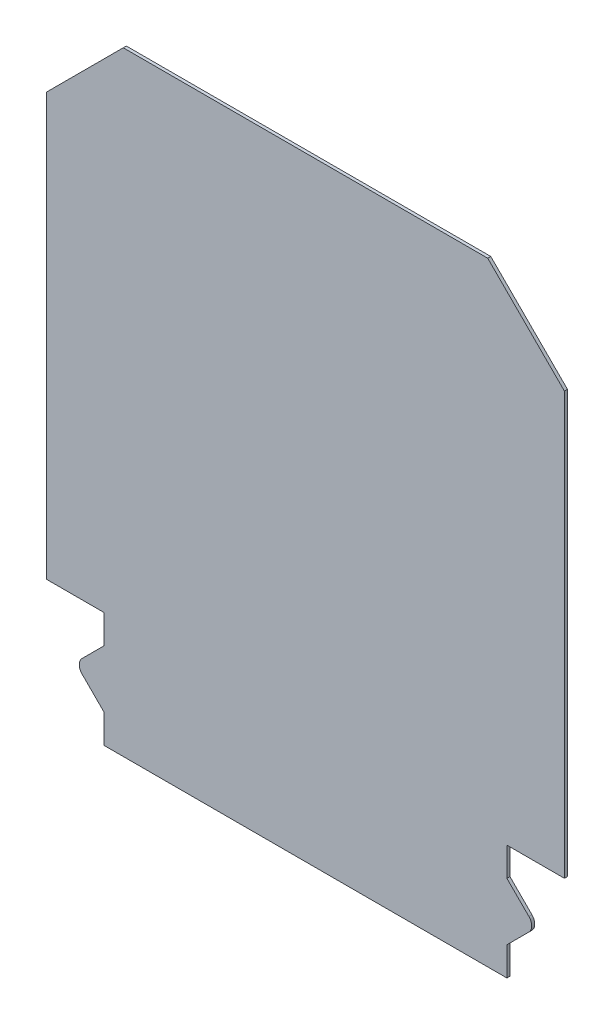
ISO-10303-21;
HEADER;
FILE_DESCRIPTION(('STEP AP214'),'2;1');
FILE_NAME('part.step','',(''),(''),'','','');
FILE_SCHEMA(('AUTOMOTIVE_DESIGN { 1 0 10303 214 1 1 1 1 }'));
ENDSEC;
DATA;
#1=APPLICATION_CONTEXT('core data for automotive mechanical design processes');
#2=APPLICATION_PROTOCOL_DEFINITION('international standard','automotive_design',2000,#1);
#3=PRODUCT_CONTEXT('',#1,'mechanical');
#4=PRODUCT('Part','Part','',(#3));
#5=PRODUCT_RELATED_PRODUCT_CATEGORY('part','',(#4));
#6=PRODUCT_DEFINITION_FORMATION('','',#4);
#7=PRODUCT_DEFINITION_CONTEXT('part definition',#1,'design');
#8=PRODUCT_DEFINITION('design','',#6,#7);
#9=PRODUCT_DEFINITION_SHAPE('','',#8);
#10=(LENGTH_UNIT() NAMED_UNIT(*) SI_UNIT(.MILLI.,.METRE.));
#11=(NAMED_UNIT(*) PLANE_ANGLE_UNIT() SI_UNIT($,.RADIAN.));
#12=(NAMED_UNIT(*) SI_UNIT($,.STERADIAN.) SOLID_ANGLE_UNIT());
#13=UNCERTAINTY_MEASURE_WITH_UNIT(LENGTH_MEASURE(1.E-05),#10,'distance_accuracy_value','');
#14=(GEOMETRIC_REPRESENTATION_CONTEXT(3) GLOBAL_UNCERTAINTY_ASSIGNED_CONTEXT((#13)) GLOBAL_UNIT_ASSIGNED_CONTEXT((#10,
#11,#12)) REPRESENTATION_CONTEXT('',''));
#15=CARTESIAN_POINT('',(0.,0.,0.));
#16=DIRECTION('',(0.,0.,1.));
#17=DIRECTION('',(1.,0.,0.));
#18=AXIS2_PLACEMENT_3D('',#15,#16,#17);
#19=CARTESIAN_POINT('',(0.,0.,3.175));
#20=DIRECTION('',(1.,0.,0.));
#21=DIRECTION('',(0.,0.,-1.));
#22=AXIS2_PLACEMENT_3D('',#19,#20,#21);
#23=PLANE('',#22);
#24=DIRECTION('',(0.,-1.,0.));
#25=VECTOR('',#24,1.);
#26=CARTESIAN_POINT('',(0.,0.,0.));
#27=LINE('',#26,#25);
#28=CARTESIAN_POINT('',(0.,560.,0.));
#29=VERTEX_POINT('',#28);
#30=CARTESIAN_POINT('',(0.,120.,0.));
#31=VERTEX_POINT('',#30);
#32=EDGE_CURVE('E249',#29,#31,#27,.T.);
#33=ORIENTED_EDGE('',*,*,#32,.T.);
#34=DIRECTION('',(0.,0.,1.));
#35=VECTOR('',#34,1.);
#36=CARTESIAN_POINT('',(0.,120.,0.));
#37=LINE('',#36,#35);
#38=CARTESIAN_POINT('',(0.,120.,3.175));
#39=VERTEX_POINT('',#38);
#40=EDGE_CURVE('E230',#31,#39,#37,.T.);
#41=ORIENTED_EDGE('',*,*,#40,.T.);
#42=DIRECTION('',(0.,-1.,0.));
#43=VECTOR('',#42,1.);
#44=CARTESIAN_POINT('',(0.,0.,3.175));
#45=LINE('',#44,#43);
#46=CARTESIAN_POINT('',(0.,560.,3.175));
#47=VERTEX_POINT('',#46);
#48=EDGE_CURVE('E181',#47,#39,#45,.T.);
#49=ORIENTED_EDGE('',*,*,#48,.F.);
#50=DIRECTION('',(0.,0.,1.));
#51=VECTOR('',#50,1.);
#52=CARTESIAN_POINT('',(0.,560.,0.));
#53=LINE('',#52,#51);
#54=EDGE_CURVE('E244',#29,#47,#53,.T.);
#55=ORIENTED_EDGE('',*,*,#54,.F.);
#56=EDGE_LOOP('',(#33,#41,#49,#55));
#57=FACE_BOUND('',#56,.T.);
#58=ADVANCED_FACE('F33',(#57),#23,.F.);
#59=CARTESIAN_POINT('',(0.,0.,3.175));
#60=DIRECTION('',(0.,1.,0.));
#61=DIRECTION('',(0.,0.,1.));
#62=AXIS2_PLACEMENT_3D('',#59,#60,#61);
#63=PLANE('',#62);
#64=DIRECTION('',(1.,0.,0.));
#65=VECTOR('',#64,1.);
#66=CARTESIAN_POINT('',(0.,0.,0.));
#67=LINE('',#66,#65);
#68=CARTESIAN_POINT('',(60.,0.,0.));
#69=VERTEX_POINT('',#68);
#70=CARTESIAN_POINT('',(480.,0.,0.));
#71=VERTEX_POINT('',#70);
#72=EDGE_CURVE('E187',#69,#71,#67,.T.);
#73=ORIENTED_EDGE('',*,*,#72,.T.);
#74=DIRECTION('',(0.,0.,1.));
#75=VECTOR('',#74,1.);
#76=CARTESIAN_POINT('',(480.,0.,0.));
#77=LINE('',#76,#75);
#78=CARTESIAN_POINT('',(480.,0.,3.175));
#79=VERTEX_POINT('',#78);
#80=EDGE_CURVE('E265',#71,#79,#77,.T.);
#81=ORIENTED_EDGE('',*,*,#80,.T.);
#82=DIRECTION('',(1.,0.,0.));
#83=VECTOR('',#82,1.);
#84=CARTESIAN_POINT('',(0.,0.,3.175));
#85=LINE('',#84,#83);
#86=CARTESIAN_POINT('',(60.,0.,3.175));
#87=VERTEX_POINT('',#86);
#88=EDGE_CURVE('E185',#87,#79,#85,.T.);
#89=ORIENTED_EDGE('',*,*,#88,.F.);
#90=DIRECTION('',(0.,0.,1.));
#91=VECTOR('',#90,1.);
#92=CARTESIAN_POINT('',(60.,0.,0.));
#93=LINE('',#92,#91);
#94=EDGE_CURVE('E240',#69,#87,#93,.T.);
#95=ORIENTED_EDGE('',*,*,#94,.F.);
#96=EDGE_LOOP('',(#73,#81,#89,#95));
#97=FACE_BOUND('',#96,.T.);
#98=ADVANCED_FACE('F263',(#97),#63,.F.);
#99=CARTESIAN_POINT('',(540.,0.,3.175));
#100=DIRECTION('',(-1.,0.,0.));
#101=DIRECTION('',(0.,0.,1.));
#102=AXIS2_PLACEMENT_3D('',#99,#100,#101);
#103=PLANE('',#102);
#104=DIRECTION('',(0.,1.,0.));
#105=VECTOR('',#104,1.);
#106=CARTESIAN_POINT('',(540.,0.,0.));
#107=LINE('',#106,#105);
#108=CARTESIAN_POINT('',(540.,120.,0.));
#109=VERTEX_POINT('',#108);
#110=CARTESIAN_POINT('',(540.,560.,0.));
#111=VERTEX_POINT('',#110);
#112=EDGE_CURVE('E182',#109,#111,#107,.T.);
#113=ORIENTED_EDGE('',*,*,#112,.T.);
#114=DIRECTION('',(0.,0.,1.));
#115=VECTOR('',#114,1.);
#116=CARTESIAN_POINT('',(540.,560.,0.));
#117=LINE('',#116,#115);
#118=CARTESIAN_POINT('',(540.,560.,3.175));
#119=VERTEX_POINT('',#118);
#120=EDGE_CURVE('E162',#111,#119,#117,.T.);
#121=ORIENTED_EDGE('',*,*,#120,.T.);
#122=DIRECTION('',(0.,1.,0.));
#123=VECTOR('',#122,1.);
#124=CARTESIAN_POINT('',(540.,0.,3.175));
#125=LINE('',#124,#123);
#126=CARTESIAN_POINT('',(540.,120.,3.175));
#127=VERTEX_POINT('',#126);
#128=EDGE_CURVE('E253',#127,#119,#125,.T.);
#129=ORIENTED_EDGE('',*,*,#128,.F.);
#130=DIRECTION('',(0.,0.,1.));
#131=VECTOR('',#130,1.);
#132=CARTESIAN_POINT('',(540.,120.,0.));
#133=LINE('',#132,#131);
#134=EDGE_CURVE('E275',#109,#127,#133,.T.);
#135=ORIENTED_EDGE('',*,*,#134,.F.);
#136=EDGE_LOOP('',(#113,#121,#129,#135));
#137=FACE_BOUND('',#136,.T.);
#138=ADVANCED_FACE('F329',(#137),#103,.F.);
#139=CARTESIAN_POINT('',(0.,640.,3.175));
#140=DIRECTION('',(0.,-1.,0.));
#141=DIRECTION('',(0.,0.,-1.));
#142=AXIS2_PLACEMENT_3D('',#139,#140,#141);
#143=PLANE('',#142);
#144=DIRECTION('',(-1.,0.,0.));
#145=VECTOR('',#144,1.);
#146=CARTESIAN_POINT('',(0.,640.,3.175));
#147=LINE('',#146,#145);
#148=CARTESIAN_POINT('',(460.,640.,3.175));
#149=VERTEX_POINT('',#148);
#150=CARTESIAN_POINT('',(80.,640.,3.175));
#151=VERTEX_POINT('',#150);
#152=EDGE_CURVE('E174',#149,#151,#147,.T.);
#153=ORIENTED_EDGE('',*,*,#152,.F.);
#154=DIRECTION('',(0.,0.,1.));
#155=VECTOR('',#154,1.);
#156=CARTESIAN_POINT('',(460.,640.,0.));
#157=LINE('',#156,#155);
#158=CARTESIAN_POINT('',(460.,640.,0.));
#159=VERTEX_POINT('',#158);
#160=EDGE_CURVE('E159',#159,#149,#157,.T.);
#161=ORIENTED_EDGE('',*,*,#160,.F.);
#162=DIRECTION('',(-1.,0.,0.));
#163=VECTOR('',#162,1.);
#164=CARTESIAN_POINT('',(0.,640.,0.));
#165=LINE('',#164,#163);
#166=CARTESIAN_POINT('',(80.0000000000001,640.,0.));
#167=VERTEX_POINT('',#166);
#168=EDGE_CURVE('E172',#159,#167,#165,.T.);
#169=ORIENTED_EDGE('',*,*,#168,.T.);
#170=DIRECTION('',(0.,0.,1.));
#171=VECTOR('',#170,1.);
#172=CARTESIAN_POINT('',(80.,640.,0.));
#173=LINE('',#172,#171);
#174=EDGE_CURVE('E247',#167,#151,#173,.T.);
#175=ORIENTED_EDGE('',*,*,#174,.T.);
#176=EDGE_LOOP('',(#153,#161,#169,#175));
#177=FACE_BOUND('',#176,.T.);
#178=ADVANCED_FACE('F170',(#177),#143,.F.);
#179=CARTESIAN_POINT('',(0.,0.,3.175));
#180=DIRECTION('',(0.,0.,-1.));
#181=DIRECTION('',(-1.,0.,0.));
#182=AXIS2_PLACEMENT_3D('',#179,#180,#181);
#183=PLANE('',#182);
#184=DIRECTION('',(-0.707106781186547,-0.707106781186547,0.));
#185=VECTOR('',#184,1.);
#186=CARTESIAN_POINT('',(510.,60.,3.175));
#187=LINE('',#186,#185);
#188=CARTESIAN_POINT('',(502.928932188135,52.9289321881345,3.175));
#189=VERTEX_POINT('',#188);
#190=CARTESIAN_POINT('',(480.,30.,3.175));
#191=VERTEX_POINT('',#190);
#192=EDGE_CURVE('E292',#189,#191,#187,.T.);
#193=ORIENTED_EDGE('',*,*,#192,.F.);
#194=CARTESIAN_POINT('',(495.857864376269,60.,3.175));
#195=DIRECTION('',(0.,0.,-1.));
#196=DIRECTION('',(-1.,0.,0.));
#197=AXIS2_PLACEMENT_3D('',#194,#195,#196);
#198=CIRCLE('',#197,10.);
#199=CARTESIAN_POINT('',(502.928932188135,67.0710678118655,3.175));
#200=VERTEX_POINT('',#199);
#201=EDGE_CURVE('E196',#189,#200,#198,.F.);
#202=ORIENTED_EDGE('',*,*,#201,.T.);
#203=DIRECTION('',(0.707106781186547,-0.707106781186548,0.));
#204=VECTOR('',#203,1.);
#205=CARTESIAN_POINT('',(480.,90.,3.175));
#206=LINE('',#205,#204);
#207=CARTESIAN_POINT('',(480.,90.,3.175));
#208=VERTEX_POINT('',#207);
#209=EDGE_CURVE('E289',#208,#200,#206,.T.);
#210=ORIENTED_EDGE('',*,*,#209,.F.);
#211=DIRECTION('',(0.,-1.,0.));
#212=VECTOR('',#211,1.);
#213=CARTESIAN_POINT('',(480.,120.,3.175));
#214=LINE('',#213,#212);
#215=CARTESIAN_POINT('',(480.,120.,3.175));
#216=VERTEX_POINT('',#215);
#217=EDGE_CURVE('E286',#216,#208,#214,.T.);
#218=ORIENTED_EDGE('',*,*,#217,.F.);
#219=DIRECTION('',(-1.,0.,0.));
#220=VECTOR('',#219,1.);
#221=CARTESIAN_POINT('',(540.,120.,3.175));
#222=LINE('',#221,#220);
#223=EDGE_CURVE('E283',#127,#216,#222,.T.);
#224=ORIENTED_EDGE('',*,*,#223,.F.);
#225=ORIENTED_EDGE('',*,*,#128,.T.);
#226=DIRECTION('',(0.707106781186548,-0.707106781186547,0.));
#227=VECTOR('',#226,1.);
#228=CARTESIAN_POINT('',(540.,560.,3.175));
#229=LINE('',#228,#227);
#230=EDGE_CURVE('E166',#149,#119,#229,.T.);
#231=ORIENTED_EDGE('',*,*,#230,.F.);
#232=ORIENTED_EDGE('',*,*,#152,.T.);
#233=DIRECTION('',(0.707106781186548,0.707106781186547,0.));
#234=VECTOR('',#233,1.);
#235=CARTESIAN_POINT('',(0.,560.,3.175));
#236=LINE('',#235,#234);
#237=EDGE_CURVE('E233',#47,#151,#236,.T.);
#238=ORIENTED_EDGE('',*,*,#237,.F.);
#239=ORIENTED_EDGE('',*,*,#48,.T.);
#240=DIRECTION('',(-1.,0.,0.));
#241=VECTOR('',#240,1.);
#242=CARTESIAN_POINT('',(0.,120.,3.175));
#243=LINE('',#242,#241);
#244=CARTESIAN_POINT('',(60.,120.,3.175));
#245=VERTEX_POINT('',#244);
#246=EDGE_CURVE('E222',#245,#39,#243,.T.);
#247=ORIENTED_EDGE('',*,*,#246,.F.);
#248=DIRECTION('',(0.,1.,0.));
#249=VECTOR('',#248,1.);
#250=CARTESIAN_POINT('',(60.,120.,3.175));
#251=LINE('',#250,#249);
#252=CARTESIAN_POINT('',(60.,90.,3.175));
#253=VERTEX_POINT('',#252);
#254=EDGE_CURVE('E219',#253,#245,#251,.T.);
#255=ORIENTED_EDGE('',*,*,#254,.F.);
#256=DIRECTION('',(0.707106781186547,0.707106781186548,0.));
#257=VECTOR('',#256,1.);
#258=CARTESIAN_POINT('',(60.,90.,3.175));
#259=LINE('',#258,#257);
#260=CARTESIAN_POINT('',(37.0710678118655,67.0710678118654,3.175));
#261=VERTEX_POINT('',#260);
#262=EDGE_CURVE('E208',#261,#253,#259,.T.);
#263=ORIENTED_EDGE('',*,*,#262,.F.);
#264=CARTESIAN_POINT('',(44.142135623731,60.,3.175));
#265=DIRECTION('',(0.,0.,-1.));
#266=DIRECTION('',(-1.,0.,0.));
#267=AXIS2_PLACEMENT_3D('',#264,#265,#266);
#268=CIRCLE('',#267,10.);
#269=CARTESIAN_POINT('',(37.0710678118655,52.9289321881345,3.175));
#270=VERTEX_POINT('',#269);
#271=EDGE_CURVE('E194',#261,#270,#268,.F.);
#272=ORIENTED_EDGE('',*,*,#271,.T.);
#273=DIRECTION('',(-0.707106781186548,0.707106781186547,0.));
#274=VECTOR('',#273,1.);
#275=CARTESIAN_POINT('',(30.,60.,3.175));
#276=LINE('',#275,#274);
#277=CARTESIAN_POINT('',(60.,30.,3.175));
#278=VERTEX_POINT('',#277);
#279=EDGE_CURVE('E220',#278,#270,#276,.T.);
#280=ORIENTED_EDGE('',*,*,#279,.F.);
#281=DIRECTION('',(0.,1.,0.));
#282=VECTOR('',#281,1.);
#283=CARTESIAN_POINT('',(60.,30.,3.175));
#284=LINE('',#283,#282);
#285=EDGE_CURVE('E224',#87,#278,#284,.T.);
#286=ORIENTED_EDGE('',*,*,#285,.F.);
#287=ORIENTED_EDGE('',*,*,#88,.T.);
#288=DIRECTION('',(0.,-1.,0.));
#289=VECTOR('',#288,1.);
#290=CARTESIAN_POINT('',(480.,30.,3.175));
#291=LINE('',#290,#289);
#292=EDGE_CURVE('E294',#191,#79,#291,.T.);
#293=ORIENTED_EDGE('',*,*,#292,.F.);
#294=EDGE_LOOP('',(#193,#202,#210,#218,#224,#225,#231,#232,#238,#239,#247,#255,#263,#272,#280,
#286,#287,#293));
#295=FACE_BOUND('',#294,.T.);
#296=ADVANCED_FACE('F215',(#295),#183,.F.);
#297=CARTESIAN_POINT('',(0.,0.,0.));
#298=DIRECTION('',(0.,0.,-1.));
#299=DIRECTION('',(-1.,0.,0.));
#300=AXIS2_PLACEMENT_3D('',#297,#298,#299);
#301=PLANE('',#300);
#302=DIRECTION('',(0.707106781186547,-0.707106781186548,0.));
#303=VECTOR('',#302,1.);
#304=CARTESIAN_POINT('',(480.,90.,0.));
#305=LINE('',#304,#303);
#306=CARTESIAN_POINT('',(480.,90.,0.));
#307=VERTEX_POINT('',#306);
#308=CARTESIAN_POINT('',(502.928932188135,67.0710678118655,0.));
#309=VERTEX_POINT('',#308);
#310=EDGE_CURVE('E279',#307,#309,#305,.T.);
#311=ORIENTED_EDGE('',*,*,#310,.T.);
#312=CARTESIAN_POINT('',(495.857864376269,60.,0.));
#313=DIRECTION('',(0.,0.,-1.));
#314=DIRECTION('',(-1.,0.,0.));
#315=AXIS2_PLACEMENT_3D('',#312,#313,#314);
#316=CIRCLE('',#315,10.);
#317=CARTESIAN_POINT('',(502.928932188135,52.9289321881345,0.));
#318=VERTEX_POINT('',#317);
#319=EDGE_CURVE('E201',#309,#318,#316,.T.);
#320=ORIENTED_EDGE('',*,*,#319,.T.);
#321=DIRECTION('',(-0.707106781186547,-0.707106781186547,0.));
#322=VECTOR('',#321,1.);
#323=CARTESIAN_POINT('',(510.,60.,0.));
#324=LINE('',#323,#322);
#325=CARTESIAN_POINT('',(480.,30.,0.));
#326=VERTEX_POINT('',#325);
#327=EDGE_CURVE('E271',#318,#326,#324,.T.);
#328=ORIENTED_EDGE('',*,*,#327,.T.);
#329=DIRECTION('',(0.,-1.,0.));
#330=VECTOR('',#329,1.);
#331=CARTESIAN_POINT('',(480.,30.,0.));
#332=LINE('',#331,#330);
#333=EDGE_CURVE('E269',#326,#71,#332,.T.);
#334=ORIENTED_EDGE('',*,*,#333,.T.);
#335=ORIENTED_EDGE('',*,*,#72,.F.);
#336=DIRECTION('',(0.,1.,0.));
#337=VECTOR('',#336,1.);
#338=CARTESIAN_POINT('',(60.,30.,0.));
#339=LINE('',#338,#337);
#340=CARTESIAN_POINT('',(60.,30.,0.));
#341=VERTEX_POINT('',#340);
#342=EDGE_CURVE('E229',#69,#341,#339,.T.);
#343=ORIENTED_EDGE('',*,*,#342,.T.);
#344=DIRECTION('',(-0.707106781186548,0.707106781186547,0.));
#345=VECTOR('',#344,1.);
#346=CARTESIAN_POINT('',(30.,60.,0.));
#347=LINE('',#346,#345);
#348=CARTESIAN_POINT('',(37.0710678118655,52.9289321881345,0.));
#349=VERTEX_POINT('',#348);
#350=EDGE_CURVE('E304',#341,#349,#347,.T.);
#351=ORIENTED_EDGE('',*,*,#350,.T.);
#352=CARTESIAN_POINT('',(44.142135623731,60.,0.));
#353=DIRECTION('',(0.,0.,-1.));
#354=DIRECTION('',(-1.,0.,0.));
#355=AXIS2_PLACEMENT_3D('',#352,#353,#354);
#356=CIRCLE('',#355,10.);
#357=CARTESIAN_POINT('',(37.0710678118655,67.0710678118654,0.));
#358=VERTEX_POINT('',#357);
#359=EDGE_CURVE('E48',#349,#358,#356,.T.);
#360=ORIENTED_EDGE('',*,*,#359,.T.);
#361=DIRECTION('',(0.707106781186547,0.707106781186548,0.));
#362=VECTOR('',#361,1.);
#363=CARTESIAN_POINT('',(60.,90.,0.));
#364=LINE('',#363,#362);
#365=CARTESIAN_POINT('',(60.,90.,0.));
#366=VERTEX_POINT('',#365);
#367=EDGE_CURVE('E210',#358,#366,#364,.T.);
#368=ORIENTED_EDGE('',*,*,#367,.T.);
#369=DIRECTION('',(0.,1.,0.));
#370=VECTOR('',#369,1.);
#371=CARTESIAN_POINT('',(60.,120.,0.));
#372=LINE('',#371,#370);
#373=CARTESIAN_POINT('',(60.,120.,0.));
#374=VERTEX_POINT('',#373);
#375=EDGE_CURVE('E307',#366,#374,#372,.T.);
#376=ORIENTED_EDGE('',*,*,#375,.T.);
#377=DIRECTION('',(-1.,0.,0.));
#378=VECTOR('',#377,1.);
#379=CARTESIAN_POINT('',(0.,120.,0.));
#380=LINE('',#379,#378);
#381=EDGE_CURVE('E242',#374,#31,#380,.T.);
#382=ORIENTED_EDGE('',*,*,#381,.T.);
#383=ORIENTED_EDGE('',*,*,#32,.F.);
#384=DIRECTION('',(0.707106781186548,0.707106781186547,0.));
#385=VECTOR('',#384,1.);
#386=CARTESIAN_POINT('',(0.,560.,0.));
#387=LINE('',#386,#385);
#388=EDGE_CURVE('E180',#29,#167,#387,.T.);
#389=ORIENTED_EDGE('',*,*,#388,.T.);
#390=ORIENTED_EDGE('',*,*,#168,.F.);
#391=DIRECTION('',(0.707106781186548,-0.707106781186547,0.));
#392=VECTOR('',#391,1.);
#393=CARTESIAN_POINT('',(540.,560.,0.));
#394=LINE('',#393,#392);
#395=EDGE_CURVE('E156',#159,#111,#394,.T.);
#396=ORIENTED_EDGE('',*,*,#395,.T.);
#397=ORIENTED_EDGE('',*,*,#112,.F.);
#398=DIRECTION('',(-1.,0.,0.));
#399=VECTOR('',#398,1.);
#400=CARTESIAN_POINT('',(540.,120.,0.));
#401=LINE('',#400,#399);
#402=CARTESIAN_POINT('',(480.,120.,0.));
#403=VERTEX_POINT('',#402);
#404=EDGE_CURVE('E296',#109,#403,#401,.T.);
#405=ORIENTED_EDGE('',*,*,#404,.T.);
#406=DIRECTION('',(0.,-1.,0.));
#407=VECTOR('',#406,1.);
#408=CARTESIAN_POINT('',(480.,120.,0.));
#409=LINE('',#408,#407);
#410=EDGE_CURVE('E503',#403,#307,#409,.T.);
#411=ORIENTED_EDGE('',*,*,#410,.T.);
#412=EDGE_LOOP('',(#311,#320,#328,#334,#335,#343,#351,#360,#368,#376,#382,#383,#389,#390,#396,
#397,#405,#411));
#413=FACE_BOUND('',#412,.T.);
#414=ADVANCED_FACE('F178',(#413),#301,.T.);
#415=CARTESIAN_POINT('',(0.,560.,0.));
#416=DIRECTION('',(0.707106781186547,-0.707106781186548,0.));
#417=DIRECTION('',(0.707106781186548,0.707106781186547,0.));
#418=AXIS2_PLACEMENT_3D('',#415,#416,#417);
#419=PLANE('',#418);
#420=ORIENTED_EDGE('',*,*,#237,.T.);
#421=ORIENTED_EDGE('',*,*,#174,.F.);
#422=ORIENTED_EDGE('',*,*,#388,.F.);
#423=ORIENTED_EDGE('',*,*,#54,.T.);
#424=EDGE_LOOP('',(#420,#421,#422,#423));
#425=FACE_BOUND('',#424,.T.);
#426=ADVANCED_FACE('F339',(#425),#419,.F.);
#427=CARTESIAN_POINT('',(0.,120.,0.));
#428=DIRECTION('',(0.,1.,0.));
#429=DIRECTION('',(0.,0.,1.));
#430=AXIS2_PLACEMENT_3D('',#427,#428,#429);
#431=PLANE('',#430);
#432=ORIENTED_EDGE('',*,*,#246,.T.);
#433=ORIENTED_EDGE('',*,*,#40,.F.);
#434=ORIENTED_EDGE('',*,*,#381,.F.);
#435=DIRECTION('',(0.,0.,1.));
#436=VECTOR('',#435,1.);
#437=CARTESIAN_POINT('',(60.,120.,0.));
#438=LINE('',#437,#436);
#439=EDGE_CURVE('E234',#374,#245,#438,.T.);
#440=ORIENTED_EDGE('',*,*,#439,.T.);
#441=EDGE_LOOP('',(#432,#433,#434,#440));
#442=FACE_BOUND('',#441,.T.);
#443=ADVANCED_FACE('F344',(#442),#431,.F.);
#444=CARTESIAN_POINT('',(60.,120.,0.));
#445=DIRECTION('',(1.,0.,0.));
#446=DIRECTION('',(0.,0.,-1.));
#447=AXIS2_PLACEMENT_3D('',#444,#445,#446);
#448=PLANE('',#447);
#449=ORIENTED_EDGE('',*,*,#254,.T.);
#450=ORIENTED_EDGE('',*,*,#439,.F.);
#451=ORIENTED_EDGE('',*,*,#375,.F.);
#452=DIRECTION('',(0.,0.,1.));
#453=VECTOR('',#452,1.);
#454=CARTESIAN_POINT('',(60.,90.,0.));
#455=LINE('',#454,#453);
#456=EDGE_CURVE('E236',#366,#253,#455,.T.);
#457=ORIENTED_EDGE('',*,*,#456,.T.);
#458=EDGE_LOOP('',(#449,#450,#451,#457));
#459=FACE_BOUND('',#458,.T.);
#460=ADVANCED_FACE('F353',(#459),#448,.F.);
#461=CARTESIAN_POINT('',(60.,90.,0.));
#462=DIRECTION('',(0.707106781186548,-0.707106781186547,0.));
#463=DIRECTION('',(0.707106781186547,0.707106781186548,0.));
#464=AXIS2_PLACEMENT_3D('',#461,#462,#463);
#465=PLANE('',#464);
#466=ORIENTED_EDGE('',*,*,#367,.F.);
#467=DIRECTION('',(0.,0.,1.));
#468=VECTOR('',#467,1.);
#469=CARTESIAN_POINT('',(37.0710678118655,67.0710678118654,0.));
#470=LINE('',#469,#468);
#471=EDGE_CURVE('E41',#358,#261,#470,.T.);
#472=ORIENTED_EDGE('',*,*,#471,.T.);
#473=ORIENTED_EDGE('',*,*,#262,.T.);
#474=ORIENTED_EDGE('',*,*,#456,.F.);
#475=EDGE_LOOP('',(#466,#472,#473,#474));
#476=FACE_BOUND('',#475,.T.);
#477=ADVANCED_FACE('F206',(#476),#465,.F.);
#478=CARTESIAN_POINT('',(30.,60.,0.));
#479=DIRECTION('',(0.707106781186547,0.707106781186548,0.));
#480=DIRECTION('',(-0.707106781186548,0.707106781186547,0.));
#481=AXIS2_PLACEMENT_3D('',#478,#479,#480);
#482=PLANE('',#481);
#483=ORIENTED_EDGE('',*,*,#279,.T.);
#484=DIRECTION('',(0.,0.,1.));
#485=VECTOR('',#484,1.);
#486=CARTESIAN_POINT('',(37.0710678118655,52.9289321881345,0.));
#487=LINE('',#486,#485);
#488=EDGE_CURVE('E11',#270,#349,#487,.F.);
#489=ORIENTED_EDGE('',*,*,#488,.T.);
#490=ORIENTED_EDGE('',*,*,#350,.F.);
#491=DIRECTION('',(0.,0.,1.));
#492=VECTOR('',#491,1.);
#493=CARTESIAN_POINT('',(60.,30.,0.));
#494=LINE('',#493,#492);
#495=EDGE_CURVE('E238',#341,#278,#494,.T.);
#496=ORIENTED_EDGE('',*,*,#495,.T.);
#497=EDGE_LOOP('',(#483,#489,#490,#496));
#498=FACE_BOUND('',#497,.T.);
#499=ADVANCED_FACE('F316',(#498),#482,.F.);
#500=CARTESIAN_POINT('',(60.,30.,0.));
#501=DIRECTION('',(1.,0.,0.));
#502=DIRECTION('',(0.,0.,-1.));
#503=AXIS2_PLACEMENT_3D('',#500,#501,#502);
#504=PLANE('',#503);
#505=ORIENTED_EDGE('',*,*,#285,.T.);
#506=ORIENTED_EDGE('',*,*,#495,.F.);
#507=ORIENTED_EDGE('',*,*,#342,.F.);
#508=ORIENTED_EDGE('',*,*,#94,.T.);
#509=EDGE_LOOP('',(#505,#506,#507,#508));
#510=FACE_BOUND('',#509,.T.);
#511=ADVANCED_FACE('F315',(#510),#504,.F.);
#512=CARTESIAN_POINT('',(480.,30.,0.));
#513=DIRECTION('',(-1.,0.,0.));
#514=DIRECTION('',(0.,0.,1.));
#515=AXIS2_PLACEMENT_3D('',#512,#513,#514);
#516=PLANE('',#515);
#517=ORIENTED_EDGE('',*,*,#292,.T.);
#518=ORIENTED_EDGE('',*,*,#80,.F.);
#519=ORIENTED_EDGE('',*,*,#333,.F.);
#520=DIRECTION('',(0.,0.,1.));
#521=VECTOR('',#520,1.);
#522=CARTESIAN_POINT('',(480.,30.,0.));
#523=LINE('',#522,#521);
#524=EDGE_CURVE('E298',#326,#191,#523,.T.);
#525=ORIENTED_EDGE('',*,*,#524,.T.);
#526=EDGE_LOOP('',(#517,#518,#519,#525));
#527=FACE_BOUND('',#526,.T.);
#528=ADVANCED_FACE('F348',(#527),#516,.F.);
#529=CARTESIAN_POINT('',(510.,60.,0.));
#530=DIRECTION('',(-0.707106781186548,0.707106781186548,0.));
#531=DIRECTION('',(-0.707106781186548,-0.707106781186548,0.));
#532=AXIS2_PLACEMENT_3D('',#529,#530,#531);
#533=PLANE('',#532);
#534=ORIENTED_EDGE('',*,*,#327,.F.);
#535=DIRECTION('',(0.,0.,1.));
#536=VECTOR('',#535,1.);
#537=CARTESIAN_POINT('',(502.928932188135,52.9289321881345,0.));
#538=LINE('',#537,#536);
#539=EDGE_CURVE('E191',#318,#189,#538,.T.);
#540=ORIENTED_EDGE('',*,*,#539,.T.);
#541=ORIENTED_EDGE('',*,*,#192,.T.);
#542=ORIENTED_EDGE('',*,*,#524,.F.);
#543=EDGE_LOOP('',(#534,#540,#541,#542));
#544=FACE_BOUND('',#543,.T.);
#545=ADVANCED_FACE('F371',(#544),#533,.F.);
#546=CARTESIAN_POINT('',(480.,90.,0.));
#547=DIRECTION('',(-0.707106781186548,-0.707106781186547,0.));
#548=DIRECTION('',(0.707106781186547,-0.707106781186548,0.));
#549=AXIS2_PLACEMENT_3D('',#546,#547,#548);
#550=PLANE('',#549);
#551=ORIENTED_EDGE('',*,*,#209,.T.);
#552=DIRECTION('',(0.,0.,1.));
#553=VECTOR('',#552,1.);
#554=CARTESIAN_POINT('',(502.928932188135,67.0710678118655,0.));
#555=LINE('',#554,#553);
#556=EDGE_CURVE('E198',#200,#309,#555,.F.);
#557=ORIENTED_EDGE('',*,*,#556,.T.);
#558=ORIENTED_EDGE('',*,*,#310,.F.);
#559=DIRECTION('',(0.,0.,1.));
#560=VECTOR('',#559,1.);
#561=CARTESIAN_POINT('',(480.,90.,0.));
#562=LINE('',#561,#560);
#563=EDGE_CURVE('E300',#307,#208,#562,.T.);
#564=ORIENTED_EDGE('',*,*,#563,.T.);
#565=EDGE_LOOP('',(#551,#557,#558,#564));
#566=FACE_BOUND('',#565,.T.);
#567=ADVANCED_FACE('F367',(#566),#550,.F.);
#568=CARTESIAN_POINT('',(480.,120.,0.));
#569=DIRECTION('',(-1.,0.,0.));
#570=DIRECTION('',(0.,0.,1.));
#571=AXIS2_PLACEMENT_3D('',#568,#569,#570);
#572=PLANE('',#571);
#573=ORIENTED_EDGE('',*,*,#217,.T.);
#574=ORIENTED_EDGE('',*,*,#563,.F.);
#575=ORIENTED_EDGE('',*,*,#410,.F.);
#576=DIRECTION('',(0.,0.,1.));
#577=VECTOR('',#576,1.);
#578=CARTESIAN_POINT('',(480.,120.,0.));
#579=LINE('',#578,#577);
#580=EDGE_CURVE('E277',#403,#216,#579,.T.);
#581=ORIENTED_EDGE('',*,*,#580,.T.);
#582=EDGE_LOOP('',(#573,#574,#575,#581));
#583=FACE_BOUND('',#582,.T.);
#584=ADVANCED_FACE('F363',(#583),#572,.F.);
#585=CARTESIAN_POINT('',(540.,120.,0.));
#586=DIRECTION('',(0.,1.,0.));
#587=DIRECTION('',(0.,0.,1.));
#588=AXIS2_PLACEMENT_3D('',#585,#586,#587);
#589=PLANE('',#588);
#590=ORIENTED_EDGE('',*,*,#223,.T.);
#591=ORIENTED_EDGE('',*,*,#580,.F.);
#592=ORIENTED_EDGE('',*,*,#404,.F.);
#593=ORIENTED_EDGE('',*,*,#134,.T.);
#594=EDGE_LOOP('',(#590,#591,#592,#593));
#595=FACE_BOUND('',#594,.T.);
#596=ADVANCED_FACE('F360',(#595),#589,.F.);
#597=CARTESIAN_POINT('',(540.,560.,0.));
#598=DIRECTION('',(-0.707106781186547,-0.707106781186548,0.));
#599=DIRECTION('',(0.707106781186548,-0.707106781186547,0.));
#600=AXIS2_PLACEMENT_3D('',#597,#598,#599);
#601=PLANE('',#600);
#602=ORIENTED_EDGE('',*,*,#230,.T.);
#603=ORIENTED_EDGE('',*,*,#120,.F.);
#604=ORIENTED_EDGE('',*,*,#395,.F.);
#605=ORIENTED_EDGE('',*,*,#160,.T.);
#606=EDGE_LOOP('',(#602,#603,#604,#605));
#607=FACE_BOUND('',#606,.T.);
#608=ADVANCED_FACE('F158',(#607),#601,.F.);
#609=CARTESIAN_POINT('',(495.857864376269,60.,0.));
#610=DIRECTION('',(0.,0.,1.));
#611=DIRECTION('',(1.,0.,0.));
#612=AXIS2_PLACEMENT_3D('',#609,#610,#611);
#613=CYLINDRICAL_SURFACE('',#612,10.);
#614=ORIENTED_EDGE('',*,*,#319,.F.);
#615=ORIENTED_EDGE('',*,*,#556,.F.);
#616=ORIENTED_EDGE('',*,*,#201,.F.);
#617=ORIENTED_EDGE('',*,*,#539,.F.);
#618=EDGE_LOOP('',(#614,#615,#616,#617));
#619=FACE_BOUND('',#618,.T.);
#620=ADVANCED_FACE('F318',(#619),#613,.T.);
#621=CARTESIAN_POINT('',(44.142135623731,60.,0.));
#622=DIRECTION('',(0.,0.,1.));
#623=DIRECTION('',(1.,0.,0.));
#624=AXIS2_PLACEMENT_3D('',#621,#622,#623);
#625=CYLINDRICAL_SURFACE('',#624,10.);
#626=ORIENTED_EDGE('',*,*,#359,.F.);
#627=ORIENTED_EDGE('',*,*,#488,.F.);
#628=ORIENTED_EDGE('',*,*,#271,.F.);
#629=ORIENTED_EDGE('',*,*,#471,.F.);
#630=EDGE_LOOP('',(#626,#627,#628,#629));
#631=FACE_BOUND('',#630,.T.);
#632=ADVANCED_FACE('F35',(#631),#625,.T.);
#633=CLOSED_SHELL('',(#58,#98,#138,#178,#296,#414,#426,#443,#460,#477,#499,#511,#528,#545,#567,
#584,#596,#608,#620,#632));
#634=MANIFOLD_SOLID_BREP('B2',#633);
#635=ADVANCED_BREP_SHAPE_REPRESENTATION('',(#18,#634),#14);
#636=SHAPE_DEFINITION_REPRESENTATION(#9,#635);
ENDSEC;
END-ISO-10303-21;
